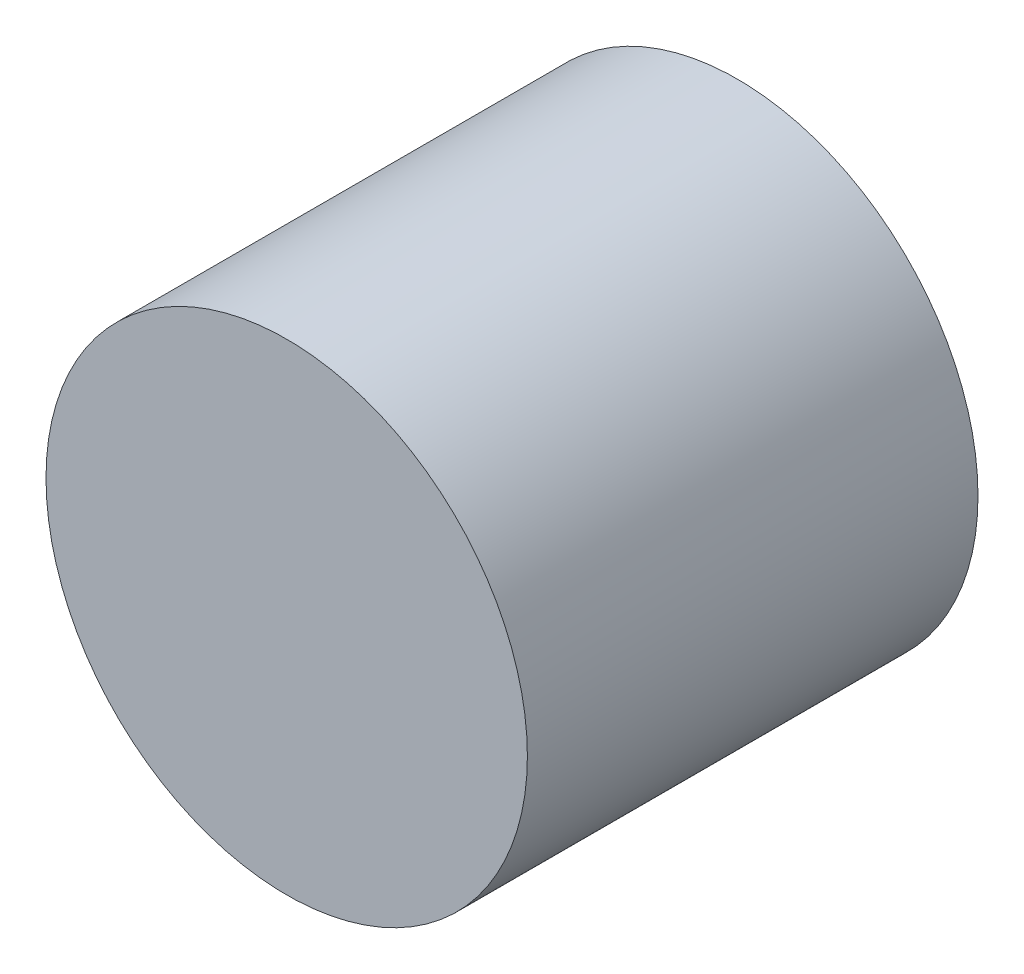
ISO-10303-21;
HEADER;
FILE_DESCRIPTION(('STEP AP214'),'2;1');
FILE_NAME('part.step','',(''),(''),'','','');
FILE_SCHEMA(('AUTOMOTIVE_DESIGN { 1 0 10303 214 1 1 1 1 }'));
ENDSEC;
DATA;
#1=APPLICATION_CONTEXT('core data for automotive mechanical design processes');
#2=APPLICATION_PROTOCOL_DEFINITION('international standard','automotive_design',2000,#1);
#3=PRODUCT_CONTEXT('',#1,'mechanical');
#4=PRODUCT('Part','Part','',(#3));
#5=PRODUCT_RELATED_PRODUCT_CATEGORY('part','',(#4));
#6=PRODUCT_DEFINITION_FORMATION('','',#4);
#7=PRODUCT_DEFINITION_CONTEXT('part definition',#1,'design');
#8=PRODUCT_DEFINITION('design','',#6,#7);
#9=PRODUCT_DEFINITION_SHAPE('','',#8);
#10=(LENGTH_UNIT() NAMED_UNIT(*) SI_UNIT(.MILLI.,.METRE.));
#11=(NAMED_UNIT(*) PLANE_ANGLE_UNIT() SI_UNIT($,.RADIAN.));
#12=(NAMED_UNIT(*) SI_UNIT($,.STERADIAN.) SOLID_ANGLE_UNIT());
#13=UNCERTAINTY_MEASURE_WITH_UNIT(LENGTH_MEASURE(1.E-05),#10,'distance_accuracy_value','');
#14=(GEOMETRIC_REPRESENTATION_CONTEXT(3) GLOBAL_UNCERTAINTY_ASSIGNED_CONTEXT((#13)) GLOBAL_UNIT_ASSIGNED_CONTEXT((#10,
#11,#12)) REPRESENTATION_CONTEXT('',''));
#15=CARTESIAN_POINT('',(0.,0.,0.));
#16=DIRECTION('',(0.,0.,1.));
#17=DIRECTION('',(1.,0.,0.));
#18=AXIS2_PLACEMENT_3D('',#15,#16,#17);
#19=CARTESIAN_POINT('',(-3.049239759512,-2.512323147986,0.));
#20=DIRECTION('',(0.,0.,1.));
#21=DIRECTION('',(-1.,0.,0.));
#22=AXIS2_PLACEMENT_3D('',#19,#20,#21);
#23=CYLINDRICAL_SURFACE('',#22,0.0534164072451479);
#24=CARTESIAN_POINT('',(-3.049239759512,-2.512323147986,0.1));
#25=DIRECTION('',(0.,0.,1.));
#26=DIRECTION('',(-1.,0.,0.));
#27=AXIS2_PLACEMENT_3D('',#24,#25,#26);
#28=CIRCLE('',#27,0.0534164072451479);
#29=CARTESIAN_POINT('',(-2.995823352267,-2.512323147986,0.1));
#30=VERTEX_POINT('',#29);
#31=EDGE_CURVE('E11',#30,#30,#28,.T.);
#32=ORIENTED_EDGE('',*,*,#31,.F.);
#33=CARTESIAN_POINT('',(-2.995823352267,-2.512323147986,0.));
#34=CARTESIAN_POINT('',(-2.995823352267,-2.512323147986,0.1));
#35=B_SPLINE_CURVE_WITH_KNOTS('',1,(#33,#34),.UNSPECIFIED.,.F.,.F.,(2,2),(0.,0.1),.UNSPECIFIED.);
#36=CARTESIAN_POINT('',(-2.995823352267,-2.512323147986,0.));
#37=VERTEX_POINT('',#36);
#38=EDGE_CURVE('E24',#37,#30,#35,.T.);
#39=ORIENTED_EDGE('',*,*,#38,.F.);
#40=CARTESIAN_POINT('',(-3.049239759512,-2.512323147986,0.));
#41=DIRECTION('',(0.,0.,-1.));
#42=DIRECTION('',(-1.,0.,0.));
#43=AXIS2_PLACEMENT_3D('',#40,#41,#42);
#44=CIRCLE('',#43,0.0534164072451479);
#45=EDGE_CURVE('E33',#37,#37,#44,.T.);
#46=ORIENTED_EDGE('',*,*,#45,.F.);
#47=ORIENTED_EDGE('',*,*,#38,.T.);
#48=EDGE_LOOP('',(#32,#39,#46,#47));
#49=FACE_BOUND('',#48,.T.);
#50=ADVANCED_FACE('F17',(#49),#23,.T.);
#51=CARTESIAN_POINT('',(-3.049239759512,-2.512323147986,0.));
#52=DIRECTION('',(0.,0.,1.));
#53=DIRECTION('',(1.,0.,0.));
#54=AXIS2_PLACEMENT_3D('',#51,#52,#53);
#55=PLANE('',#54);
#56=ORIENTED_EDGE('',*,*,#45,.T.);
#57=EDGE_LOOP('',(#56));
#58=FACE_BOUND('',#57,.T.);
#59=ADVANCED_FACE('F35',(#58),#55,.F.);
#60=CARTESIAN_POINT('',(-3.049239759512,-2.512323147986,0.1));
#61=DIRECTION('',(0.,0.,1.));
#62=DIRECTION('',(1.,0.,0.));
#63=AXIS2_PLACEMENT_3D('',#60,#61,#62);
#64=PLANE('',#63);
#65=ORIENTED_EDGE('',*,*,#31,.T.);
#66=EDGE_LOOP('',(#65));
#67=FACE_BOUND('',#66,.T.);
#68=ADVANCED_FACE('F43',(#67),#64,.T.);
#69=CLOSED_SHELL('',(#50,#59,#68));
#70=MANIFOLD_SOLID_BREP('B1',#69);
#71=ADVANCED_BREP_SHAPE_REPRESENTATION('',(#18,#70),#14);
#72=SHAPE_DEFINITION_REPRESENTATION(#9,#71);
ENDSEC;
END-ISO-10303-21;
